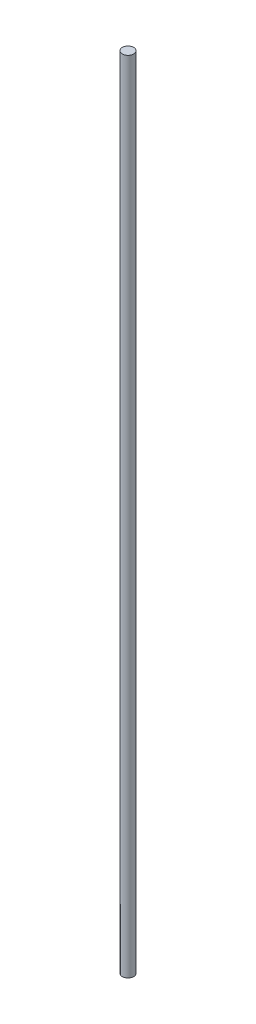
ISO-10303-21;
HEADER;
FILE_DESCRIPTION(('STEP AP214'),'2;1');
FILE_NAME('part.step','',(''),(''),'','','');
FILE_SCHEMA(('AUTOMOTIVE_DESIGN { 1 0 10303 214 1 1 1 1 }'));
ENDSEC;
DATA;
#1=APPLICATION_CONTEXT('core data for automotive mechanical design processes');
#2=APPLICATION_PROTOCOL_DEFINITION('international standard','automotive_design',2000,#1);
#3=PRODUCT_CONTEXT('',#1,'mechanical');
#4=PRODUCT('Part','Part','',(#3));
#5=PRODUCT_RELATED_PRODUCT_CATEGORY('part','',(#4));
#6=PRODUCT_DEFINITION_FORMATION('','',#4);
#7=PRODUCT_DEFINITION_CONTEXT('part definition',#1,'design');
#8=PRODUCT_DEFINITION('design','',#6,#7);
#9=PRODUCT_DEFINITION_SHAPE('','',#8);
#10=(LENGTH_UNIT() NAMED_UNIT(*) SI_UNIT(.MILLI.,.METRE.));
#11=(NAMED_UNIT(*) PLANE_ANGLE_UNIT() SI_UNIT($,.RADIAN.));
#12=(NAMED_UNIT(*) SI_UNIT($,.STERADIAN.) SOLID_ANGLE_UNIT());
#13=UNCERTAINTY_MEASURE_WITH_UNIT(LENGTH_MEASURE(1.E-05),#10,'distance_accuracy_value','');
#14=(GEOMETRIC_REPRESENTATION_CONTEXT(3) GLOBAL_UNCERTAINTY_ASSIGNED_CONTEXT((#13)) GLOBAL_UNIT_ASSIGNED_CONTEXT((#10,
#11,#12)) REPRESENTATION_CONTEXT('',''));
#15=CARTESIAN_POINT('',(0.,0.,0.));
#16=DIRECTION('',(0.,0.,1.));
#17=DIRECTION('',(1.,0.,0.));
#18=AXIS2_PLACEMENT_3D('',#15,#16,#17);
#19=CARTESIAN_POINT('',(0.,560.,0.));
#20=DIRECTION('',(0.,-1.,0.));
#21=DIRECTION('',(0.,0.,-1.));
#22=AXIS2_PLACEMENT_3D('',#19,#20,#21);
#23=CYLINDRICAL_SURFACE('',#22,4.);
#24=CARTESIAN_POINT('',(0.,560.,0.));
#25=DIRECTION('',(0.,1.,0.));
#26=DIRECTION('',(0.,0.,1.));
#27=AXIS2_PLACEMENT_3D('',#24,#25,#26);
#28=CIRCLE('',#27,4.);
#29=CARTESIAN_POINT('',(0.,560.,4.));
#30=VERTEX_POINT('',#29);
#31=EDGE_CURVE('E10',#30,#30,#28,.T.);
#32=ORIENTED_EDGE('',*,*,#31,.F.);
#33=EDGE_LOOP('',(#32));
#34=FACE_BOUND('',#33,.T.);
#35=CARTESIAN_POINT('',(0.,0.,0.));
#36=DIRECTION('',(0.,1.,0.));
#37=DIRECTION('',(0.,0.,1.));
#38=AXIS2_PLACEMENT_3D('',#35,#36,#37);
#39=CIRCLE('',#38,4.);
#40=CARTESIAN_POINT('',(0.,0.,4.));
#41=VERTEX_POINT('',#40);
#42=EDGE_CURVE('E34',#41,#41,#39,.T.);
#43=ORIENTED_EDGE('',*,*,#42,.T.);
#44=EDGE_LOOP('',(#43));
#45=FACE_BOUND('',#44,.T.);
#46=ADVANCED_FACE('F31',(#34,#45),#23,.T.);
#47=CARTESIAN_POINT('',(0.,560.,0.));
#48=DIRECTION('',(0.,1.,0.));
#49=DIRECTION('',(0.,0.,1.));
#50=AXIS2_PLACEMENT_3D('',#47,#48,#49);
#51=PLANE('',#50);
#52=ORIENTED_EDGE('',*,*,#31,.T.);
#53=EDGE_LOOP('',(#52));
#54=FACE_BOUND('',#53,.T.);
#55=ADVANCED_FACE('F46',(#54),#51,.T.);
#56=CARTESIAN_POINT('',(0.,0.,0.));
#57=DIRECTION('',(0.,1.,0.));
#58=DIRECTION('',(0.,0.,1.));
#59=AXIS2_PLACEMENT_3D('',#56,#57,#58);
#60=PLANE('',#59);
#61=ORIENTED_EDGE('',*,*,#42,.F.);
#62=EDGE_LOOP('',(#61));
#63=FACE_BOUND('',#62,.T.);
#64=ADVANCED_FACE('F44',(#63),#60,.F.);
#65=CLOSED_SHELL('',(#46,#55,#64));
#66=MANIFOLD_SOLID_BREP('B2',#65);
#67=ADVANCED_BREP_SHAPE_REPRESENTATION('',(#18,#66),#14);
#68=SHAPE_DEFINITION_REPRESENTATION(#9,#67);
ENDSEC;
END-ISO-10303-21;
